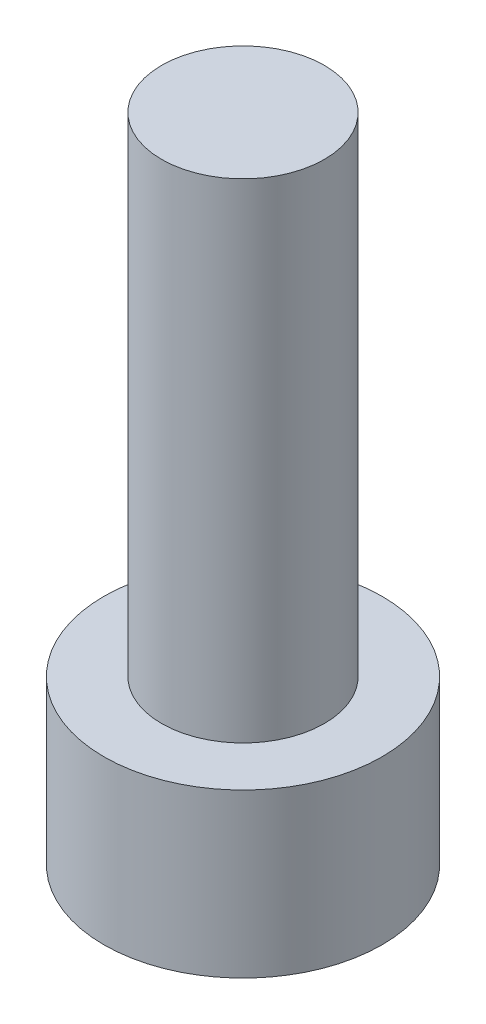
ISO-10303-21;
HEADER;
FILE_DESCRIPTION(('STEP AP214'),'2;1');
FILE_NAME('part.step','',(''),(''),'','','');
FILE_SCHEMA(('AUTOMOTIVE_DESIGN { 1 0 10303 214 1 1 1 1 }'));
ENDSEC;
DATA;
#1=APPLICATION_CONTEXT('core data for automotive mechanical design processes');
#2=APPLICATION_PROTOCOL_DEFINITION('international standard','automotive_design',2000,#1);
#3=PRODUCT_CONTEXT('',#1,'mechanical');
#4=PRODUCT('Part','Part','',(#3));
#5=PRODUCT_RELATED_PRODUCT_CATEGORY('part','',(#4));
#6=PRODUCT_DEFINITION_FORMATION('','',#4);
#7=PRODUCT_DEFINITION_CONTEXT('part definition',#1,'design');
#8=PRODUCT_DEFINITION('design','',#6,#7);
#9=PRODUCT_DEFINITION_SHAPE('','',#8);
#10=(LENGTH_UNIT() NAMED_UNIT(*) SI_UNIT(.MILLI.,.METRE.));
#11=(NAMED_UNIT(*) PLANE_ANGLE_UNIT() SI_UNIT($,.RADIAN.));
#12=(NAMED_UNIT(*) SI_UNIT($,.STERADIAN.) SOLID_ANGLE_UNIT());
#13=UNCERTAINTY_MEASURE_WITH_UNIT(LENGTH_MEASURE(1.E-05),#10,'distance_accuracy_value','');
#14=(GEOMETRIC_REPRESENTATION_CONTEXT(3) GLOBAL_UNCERTAINTY_ASSIGNED_CONTEXT((#13)) GLOBAL_UNIT_ASSIGNED_CONTEXT((#10,
#11,#12)) REPRESENTATION_CONTEXT('',''));
#15=CARTESIAN_POINT('',(0.,0.,0.));
#16=DIRECTION('',(0.,0.,1.));
#17=DIRECTION('',(1.,0.,0.));
#18=AXIS2_PLACEMENT_3D('',#15,#16,#17);
#19=CARTESIAN_POINT('',(0.,4.,0.));
#20=DIRECTION('',(0.,-1.,0.));
#21=DIRECTION('',(0.,0.,-1.));
#22=AXIS2_PLACEMENT_3D('',#19,#20,#21);
#23=CYLINDRICAL_SURFACE('',#22,3.415);
#24=CARTESIAN_POINT('',(0.,4.,0.));
#25=DIRECTION('',(0.,1.,0.));
#26=DIRECTION('',(0.,0.,1.));
#27=AXIS2_PLACEMENT_3D('',#24,#25,#26);
#28=CIRCLE('',#27,3.415);
#29=CARTESIAN_POINT('',(0.,4.,3.415));
#30=VERTEX_POINT('',#29);
#31=EDGE_CURVE('E10',#30,#30,#28,.T.);
#32=ORIENTED_EDGE('',*,*,#31,.F.);
#33=EDGE_LOOP('',(#32));
#34=FACE_BOUND('',#33,.T.);
#35=CARTESIAN_POINT('',(0.,0.,0.));
#36=DIRECTION('',(0.,1.,0.));
#37=DIRECTION('',(0.,0.,1.));
#38=AXIS2_PLACEMENT_3D('',#35,#36,#37);
#39=CIRCLE('',#38,3.415);
#40=CARTESIAN_POINT('',(0.,0.,3.415));
#41=VERTEX_POINT('',#40);
#42=EDGE_CURVE('E36',#41,#41,#39,.T.);
#43=ORIENTED_EDGE('',*,*,#42,.T.);
#44=EDGE_LOOP('',(#43));
#45=FACE_BOUND('',#44,.T.);
#46=ADVANCED_FACE('F33',(#34,#45),#23,.T.);
#47=CARTESIAN_POINT('',(0.,4.,0.));
#48=DIRECTION('',(0.,1.,0.));
#49=DIRECTION('',(0.,0.,1.));
#50=AXIS2_PLACEMENT_3D('',#47,#48,#49);
#51=PLANE('',#50);
#52=CARTESIAN_POINT('',(0.,4.,0.));
#53=DIRECTION('',(0.,1.,0.));
#54=DIRECTION('',(0.,0.,1.));
#55=AXIS2_PLACEMENT_3D('',#52,#53,#54);
#56=CIRCLE('',#55,2.);
#57=CARTESIAN_POINT('',(0.,4.,2.));
#58=VERTEX_POINT('',#57);
#59=EDGE_CURVE('E45',#58,#58,#56,.T.);
#60=ORIENTED_EDGE('',*,*,#59,.F.);
#61=EDGE_LOOP('',(#60));
#62=FACE_BOUND('',#61,.T.);
#63=ORIENTED_EDGE('',*,*,#31,.T.);
#64=EDGE_LOOP('',(#63));
#65=FACE_BOUND('',#64,.T.);
#66=ADVANCED_FACE('F60',(#62,#65),#51,.T.);
#67=CARTESIAN_POINT('',(0.,0.,0.));
#68=DIRECTION('',(0.,1.,0.));
#69=DIRECTION('',(0.,0.,1.));
#70=AXIS2_PLACEMENT_3D('',#67,#68,#69);
#71=PLANE('',#70);
#72=ORIENTED_EDGE('',*,*,#42,.F.);
#73=EDGE_LOOP('',(#72));
#74=FACE_BOUND('',#73,.T.);
#75=ADVANCED_FACE('F56',(#74),#71,.F.);
#76=CARTESIAN_POINT('',(0.,16.,0.));
#77=DIRECTION('',(0.,-1.,0.));
#78=DIRECTION('',(0.,0.,-1.));
#79=AXIS2_PLACEMENT_3D('',#76,#77,#78);
#80=CYLINDRICAL_SURFACE('',#79,2.);
#81=CARTESIAN_POINT('',(0.,16.,0.));
#82=DIRECTION('',(0.,1.,0.));
#83=DIRECTION('',(0.,0.,1.));
#84=AXIS2_PLACEMENT_3D('',#81,#82,#83);
#85=CIRCLE('',#84,2.);
#86=CARTESIAN_POINT('',(0.,16.,2.));
#87=VERTEX_POINT('',#86);
#88=EDGE_CURVE('E43',#87,#87,#85,.T.);
#89=ORIENTED_EDGE('',*,*,#88,.F.);
#90=EDGE_LOOP('',(#89));
#91=FACE_BOUND('',#90,.T.);
#92=ORIENTED_EDGE('',*,*,#59,.T.);
#93=EDGE_LOOP('',(#92));
#94=FACE_BOUND('',#93,.T.);
#95=ADVANCED_FACE('F53',(#91,#94),#80,.T.);
#96=CARTESIAN_POINT('',(0.,16.,0.));
#97=DIRECTION('',(0.,1.,0.));
#98=DIRECTION('',(0.,0.,1.));
#99=AXIS2_PLACEMENT_3D('',#96,#97,#98);
#100=PLANE('',#99);
#101=ORIENTED_EDGE('',*,*,#88,.T.);
#102=EDGE_LOOP('',(#101));
#103=FACE_BOUND('',#102,.T.);
#104=ADVANCED_FACE('F51',(#103),#100,.T.);
#105=CLOSED_SHELL('',(#46,#66,#75,#95,#104));
#106=MANIFOLD_SOLID_BREP('B2',#105);
#107=ADVANCED_BREP_SHAPE_REPRESENTATION('',(#18,#106),#14);
#108=SHAPE_DEFINITION_REPRESENTATION(#9,#107);
ENDSEC;
END-ISO-10303-21;
